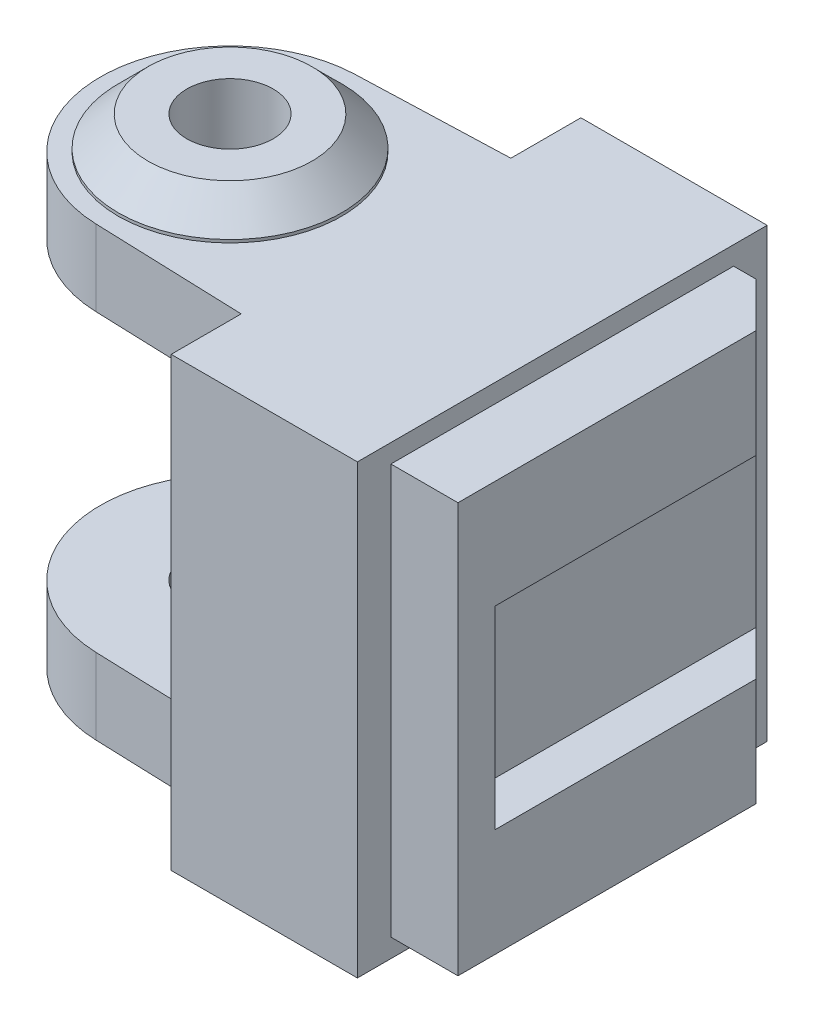
ISO-10303-21;
HEADER;
FILE_DESCRIPTION(('STEP AP214'),'2;1');
FILE_NAME('part.step','',(''),(''),'','','');
FILE_SCHEMA(('AUTOMOTIVE_DESIGN { 1 0 10303 214 1 1 1 1 }'));
ENDSEC;
DATA;
#1=APPLICATION_CONTEXT('core data for automotive mechanical design processes');
#2=APPLICATION_PROTOCOL_DEFINITION('international standard','automotive_design',2000,#1);
#3=PRODUCT_CONTEXT('',#1,'mechanical');
#4=PRODUCT('Part','Part','',(#3));
#5=PRODUCT_RELATED_PRODUCT_CATEGORY('part','',(#4));
#6=PRODUCT_DEFINITION_FORMATION('','',#4);
#7=PRODUCT_DEFINITION_CONTEXT('part definition',#1,'design');
#8=PRODUCT_DEFINITION('design','',#6,#7);
#9=PRODUCT_DEFINITION_SHAPE('','',#8);
#10=(LENGTH_UNIT() NAMED_UNIT(*) SI_UNIT(.MILLI.,.METRE.));
#11=(NAMED_UNIT(*) PLANE_ANGLE_UNIT() SI_UNIT($,.RADIAN.));
#12=(NAMED_UNIT(*) SI_UNIT($,.STERADIAN.) SOLID_ANGLE_UNIT());
#13=UNCERTAINTY_MEASURE_WITH_UNIT(LENGTH_MEASURE(1.E-05),#10,'distance_accuracy_value','');
#14=(GEOMETRIC_REPRESENTATION_CONTEXT(3) GLOBAL_UNCERTAINTY_ASSIGNED_CONTEXT((#13)) GLOBAL_UNIT_ASSIGNED_CONTEXT((#10,
#11,#12)) REPRESENTATION_CONTEXT('',''));
#15=CARTESIAN_POINT('',(0.,0.,0.));
#16=DIRECTION('',(0.,0.,1.));
#17=DIRECTION('',(1.,0.,0.));
#18=AXIS2_PLACEMENT_3D('',#15,#16,#17);
#19=CARTESIAN_POINT('',(26.8,0.,-8.5));
#20=DIRECTION('',(-0.707106781186547,0.,0.707106781186548));
#21=DIRECTION('',(0.,1.,0.));
#22=AXIS2_PLACEMENT_3D('',#19,#20,#21);
#23=PLANE('',#22);
#24=DIRECTION('',(0.707106781186548,0.,0.707106781186547));
#25=VECTOR('',#24,1.);
#26=CARTESIAN_POINT('',(26.8,8.5,-8.5));
#27=LINE('',#26,#25);
#28=CARTESIAN_POINT('',(26.8,8.5,-8.5));
#29=VERTEX_POINT('',#28);
#30=CARTESIAN_POINT('',(23.8,8.5,-11.5));
#31=VERTEX_POINT('',#30);
#32=EDGE_CURVE('E213',#29,#31,#27,.F.);
#33=ORIENTED_EDGE('',*,*,#32,.F.);
#34=DIRECTION('',(0.,1.,0.));
#35=VECTOR('',#34,1.);
#36=CARTESIAN_POINT('',(26.8,0.,-8.5));
#37=LINE('',#36,#35);
#38=CARTESIAN_POINT('',(26.8,1.25,-8.5));
#39=VERTEX_POINT('',#38);
#40=EDGE_CURVE('E359',#39,#29,#37,.T.);
#41=ORIENTED_EDGE('',*,*,#40,.F.);
#42=DIRECTION('',(-0.707106781186548,0.,-0.707106781186547));
#43=VECTOR('',#42,1.);
#44=CARTESIAN_POINT('',(34.55,1.25,-0.750000000000023));
#45=LINE('',#44,#43);
#46=CARTESIAN_POINT('',(23.8,1.25,-11.5));
#47=VERTEX_POINT('',#46);
#48=EDGE_CURVE('E214',#47,#39,#45,.F.);
#49=ORIENTED_EDGE('',*,*,#48,.F.);
#50=DIRECTION('',(0.,-1.,0.));
#51=VECTOR('',#50,1.);
#52=CARTESIAN_POINT('',(23.8,28.75,-11.5));
#53=LINE('',#52,#51);
#54=EDGE_CURVE('E68',#31,#47,#53,.T.);
#55=ORIENTED_EDGE('',*,*,#54,.F.);
#56=EDGE_LOOP('',(#33,#41,#49,#55));
#57=FACE_BOUND('',#56,.T.);
#58=ADVANCED_FACE('F44',(#57),#23,.F.);
#59=CARTESIAN_POINT('',(0.,30.,0.));
#60=DIRECTION('',(0.,1.,0.));
#61=DIRECTION('',(0.,0.,1.));
#62=AXIS2_PLACEMENT_3D('',#59,#60,#61);
#63=PLANE('',#62);
#64=CARTESIAN_POINT('',(0.,30.,0.));
#65=DIRECTION('',(0.,1.,0.));
#66=DIRECTION('',(0.,0.,1.));
#67=AXIS2_PLACEMENT_3D('',#64,#65,#66);
#68=CIRCLE('',#67,7.5);
#69=CARTESIAN_POINT('',(0.,30.,7.5));
#70=VERTEX_POINT('',#69);
#71=EDGE_CURVE('E227',#70,#70,#68,.T.);
#72=ORIENTED_EDGE('',*,*,#71,.F.);
#73=EDGE_LOOP('',(#72));
#74=FACE_BOUND('',#73,.T.);
#75=DIRECTION('',(-1.,0.,0.));
#76=VECTOR('',#75,1.);
#77=CARTESIAN_POINT('',(26.8,30.,13.75));
#78=LINE('',#77,#76);
#79=CARTESIAN_POINT('',(22.3,30.,13.75));
#80=VERTEX_POINT('',#79);
#81=CARTESIAN_POINT('',(9.8,30.,13.75));
#82=VERTEX_POINT('',#81);
#83=EDGE_CURVE('E434',#80,#82,#78,.T.);
#84=ORIENTED_EDGE('',*,*,#83,.F.);
#85=DIRECTION('',(0.,0.,1.));
#86=VECTOR('',#85,1.);
#87=CARTESIAN_POINT('',(22.3,30.,-13.75));
#88=LINE('',#87,#86);
#89=CARTESIAN_POINT('',(22.3,30.,-13.75));
#90=VERTEX_POINT('',#89);
#91=EDGE_CURVE('E385',#90,#80,#88,.T.);
#92=ORIENTED_EDGE('',*,*,#91,.F.);
#93=DIRECTION('',(-1.,0.,0.));
#94=VECTOR('',#93,1.);
#95=CARTESIAN_POINT('',(26.8,30.,-13.75));
#96=LINE('',#95,#94);
#97=CARTESIAN_POINT('',(9.8,30.,-13.75));
#98=VERTEX_POINT('',#97);
#99=EDGE_CURVE('E436',#90,#98,#96,.T.);
#100=ORIENTED_EDGE('',*,*,#99,.T.);
#101=DIRECTION('',(0.,0.,1.));
#102=VECTOR('',#101,1.);
#103=CARTESIAN_POINT('',(9.8,30.,13.75));
#104=LINE('',#103,#102);
#105=CARTESIAN_POINT('',(9.8,30.,-9.05));
#106=VERTEX_POINT('',#105);
#107=EDGE_CURVE('E431',#98,#106,#104,.T.);
#108=ORIENTED_EDGE('',*,*,#107,.T.);
#109=DIRECTION('',(-0.999382264938366,0.,0.0351438262951239));
#110=VECTOR('',#109,1.);
#111=CARTESIAN_POINT('',(-0.305751288767575,30.,-8.69462570496378));
#112=LINE('',#111,#110);
#113=CARTESIAN_POINT('',(-0.305751288767575,30.,-8.69462570496378));
#114=VERTEX_POINT('',#113);
#115=EDGE_CURVE('E341',#106,#114,#112,.T.);
#116=ORIENTED_EDGE('',*,*,#115,.T.);
#117=CARTESIAN_POINT('',(0.,30.,0.));
#118=DIRECTION('',(0.,1.,0.));
#119=DIRECTION('',(0.,0.,1.));
#120=AXIS2_PLACEMENT_3D('',#117,#118,#119);
#121=CIRCLE('',#120,8.7);
#122=CARTESIAN_POINT('',(-0.305751288767575,30.,8.69462570496378));
#123=VERTEX_POINT('',#122);
#124=EDGE_CURVE('E443',#114,#123,#121,.T.);
#125=ORIENTED_EDGE('',*,*,#124,.T.);
#126=DIRECTION('',(0.999382264938366,0.,0.0351438262951239));
#127=VECTOR('',#126,1.);
#128=CARTESIAN_POINT('',(9.8,30.,9.05));
#129=LINE('',#128,#127);
#130=CARTESIAN_POINT('',(9.8,30.,9.05));
#131=VERTEX_POINT('',#130);
#132=EDGE_CURVE('E345',#123,#131,#129,.T.);
#133=ORIENTED_EDGE('',*,*,#132,.T.);
#134=EDGE_CURVE('E430',#131,#82,#104,.T.);
#135=ORIENTED_EDGE('',*,*,#134,.T.);
#136=EDGE_LOOP('',(#84,#92,#100,#108,#116,#125,#133,#135));
#137=FACE_BOUND('',#136,.T.);
#138=ADVANCED_FACE('F249',(#74,#137),#63,.T.);
#139=CARTESIAN_POINT('',(0.,0.,0.));
#140=DIRECTION('',(0.,1.,0.));
#141=DIRECTION('',(0.,0.,1.));
#142=AXIS2_PLACEMENT_3D('',#139,#140,#141);
#143=PLANE('',#142);
#144=CARTESIAN_POINT('',(0.,0.,0.));
#145=DIRECTION('',(0.,1.,0.));
#146=DIRECTION('',(0.,0.,1.));
#147=AXIS2_PLACEMENT_3D('',#144,#145,#146);
#148=CIRCLE('',#147,7.5);
#149=CARTESIAN_POINT('',(0.,0.,7.5));
#150=VERTEX_POINT('',#149);
#151=EDGE_CURVE('E536',#150,#150,#148,.T.);
#152=ORIENTED_EDGE('',*,*,#151,.T.);
#153=EDGE_LOOP('',(#152));
#154=FACE_BOUND('',#153,.T.);
#155=DIRECTION('',(0.,0.,-1.));
#156=VECTOR('',#155,1.);
#157=CARTESIAN_POINT('',(22.3,0.,13.75));
#158=LINE('',#157,#156);
#159=CARTESIAN_POINT('',(22.3,0.,13.75));
#160=VERTEX_POINT('',#159);
#161=CARTESIAN_POINT('',(22.3,0.,-13.75));
#162=VERTEX_POINT('',#161);
#163=EDGE_CURVE('E395',#160,#162,#158,.T.);
#164=ORIENTED_EDGE('',*,*,#163,.F.);
#165=DIRECTION('',(-1.,0.,0.));
#166=VECTOR('',#165,1.);
#167=CARTESIAN_POINT('',(26.8,0.,13.75));
#168=LINE('',#167,#166);
#169=CARTESIAN_POINT('',(9.8,0.,13.75));
#170=VERTEX_POINT('',#169);
#171=EDGE_CURVE('E440',#160,#170,#168,.T.);
#172=ORIENTED_EDGE('',*,*,#171,.T.);
#173=DIRECTION('',(0.,0.,-1.));
#174=VECTOR('',#173,1.);
#175=CARTESIAN_POINT('',(9.8,0.,13.75));
#176=LINE('',#175,#174);
#177=CARTESIAN_POINT('',(9.8,0.,9.05));
#178=VERTEX_POINT('',#177);
#179=EDGE_CURVE('E424',#170,#178,#176,.T.);
#180=ORIENTED_EDGE('',*,*,#179,.T.);
#181=DIRECTION('',(0.999382264938366,0.,0.0351438262951239));
#182=VECTOR('',#181,1.);
#183=CARTESIAN_POINT('',(9.8,0.,9.05));
#184=LINE('',#183,#182);
#185=CARTESIAN_POINT('',(-0.305751288767575,0.,8.69462570496378));
#186=VERTEX_POINT('',#185);
#187=EDGE_CURVE('E447',#186,#178,#184,.T.);
#188=ORIENTED_EDGE('',*,*,#187,.F.);
#189=CARTESIAN_POINT('',(0.,0.,0.));
#190=DIRECTION('',(0.,1.,0.));
#191=DIRECTION('',(0.,0.,1.));
#192=AXIS2_PLACEMENT_3D('',#189,#190,#191);
#193=CIRCLE('',#192,8.7);
#194=CARTESIAN_POINT('',(-0.305751288767575,0.,-8.69462570496378));
#195=VERTEX_POINT('',#194);
#196=EDGE_CURVE('E442',#195,#186,#193,.T.);
#197=ORIENTED_EDGE('',*,*,#196,.F.);
#198=DIRECTION('',(-0.999382264938366,0.,0.0351438262951239));
#199=VECTOR('',#198,1.);
#200=CARTESIAN_POINT('',(-0.305751288767575,0.,-8.69462570496378));
#201=LINE('',#200,#199);
#202=CARTESIAN_POINT('',(9.8,0.,-9.05));
#203=VERTEX_POINT('',#202);
#204=EDGE_CURVE('E338',#203,#195,#201,.T.);
#205=ORIENTED_EDGE('',*,*,#204,.F.);
#206=CARTESIAN_POINT('',(9.8,0.,-13.75));
#207=VERTEX_POINT('',#206);
#208=EDGE_CURVE('E423',#203,#207,#176,.T.);
#209=ORIENTED_EDGE('',*,*,#208,.T.);
#210=DIRECTION('',(-1.,0.,0.));
#211=VECTOR('',#210,1.);
#212=CARTESIAN_POINT('',(26.8,0.,-13.75));
#213=LINE('',#212,#211);
#214=EDGE_CURVE('E438',#162,#207,#213,.T.);
#215=ORIENTED_EDGE('',*,*,#214,.F.);
#216=EDGE_LOOP('',(#164,#172,#180,#188,#197,#205,#209,#215));
#217=FACE_BOUND('',#216,.T.);
#218=ADVANCED_FACE('F255',(#154,#217),#143,.F.);
#219=CARTESIAN_POINT('',(26.8,30.,13.75));
#220=DIRECTION('',(0.,0.,-1.));
#221=DIRECTION('',(0.,1.,0.));
#222=AXIS2_PLACEMENT_3D('',#219,#220,#221);
#223=PLANE('',#222);
#224=DIRECTION('',(0.,-1.,0.));
#225=VECTOR('',#224,1.);
#226=CARTESIAN_POINT('',(22.3,30.,13.75));
#227=LINE('',#226,#225);
#228=EDGE_CURVE('E393',#80,#160,#227,.T.);
#229=ORIENTED_EDGE('',*,*,#228,.F.);
#230=ORIENTED_EDGE('',*,*,#83,.T.);
#231=DIRECTION('',(0.,-1.,0.));
#232=VECTOR('',#231,1.);
#233=CARTESIAN_POINT('',(9.8,30.,13.75));
#234=LINE('',#233,#232);
#235=EDGE_CURVE('E409',#82,#170,#234,.T.);
#236=ORIENTED_EDGE('',*,*,#235,.T.);
#237=ORIENTED_EDGE('',*,*,#171,.F.);
#238=EDGE_LOOP('',(#229,#230,#236,#237));
#239=FACE_BOUND('',#238,.T.);
#240=ADVANCED_FACE('F293',(#239),#223,.F.);
#241=CARTESIAN_POINT('',(26.8,30.,-13.75));
#242=DIRECTION('',(0.,0.,1.));
#243=DIRECTION('',(0.,-1.,0.));
#244=AXIS2_PLACEMENT_3D('',#241,#242,#243);
#245=PLANE('',#244);
#246=DIRECTION('',(0.,1.,0.));
#247=VECTOR('',#246,1.);
#248=CARTESIAN_POINT('',(22.3,0.,-13.75));
#249=LINE('',#248,#247);
#250=EDGE_CURVE('E397',#162,#90,#249,.T.);
#251=ORIENTED_EDGE('',*,*,#250,.F.);
#252=ORIENTED_EDGE('',*,*,#214,.T.);
#253=DIRECTION('',(0.,1.,0.));
#254=VECTOR('',#253,1.);
#255=CARTESIAN_POINT('',(9.8,30.,-13.75));
#256=LINE('',#255,#254);
#257=EDGE_CURVE('E427',#207,#98,#256,.T.);
#258=ORIENTED_EDGE('',*,*,#257,.T.);
#259=ORIENTED_EDGE('',*,*,#99,.F.);
#260=EDGE_LOOP('',(#251,#252,#258,#259));
#261=FACE_BOUND('',#260,.T.);
#262=ADVANCED_FACE('F289',(#261),#245,.F.);
#263=CARTESIAN_POINT('',(0.,30.,0.));
#264=DIRECTION('',(0.,-1.,0.));
#265=DIRECTION('',(0.,0.,-1.));
#266=AXIS2_PLACEMENT_3D('',#263,#264,#265);
#267=CYLINDRICAL_SURFACE('',#266,8.7);
#268=CARTESIAN_POINT('',(0.,5.1,0.));
#269=DIRECTION('',(0.,1.,0.));
#270=DIRECTION('',(0.,0.,1.));
#271=AXIS2_PLACEMENT_3D('',#268,#269,#270);
#272=CIRCLE('',#271,8.7);
#273=CARTESIAN_POINT('',(-0.305751288767575,5.1,8.69462570496378));
#274=VERTEX_POINT('',#273);
#275=CARTESIAN_POINT('',(-0.305751288767575,5.1,-8.69462570496378));
#276=VERTEX_POINT('',#275);
#277=EDGE_CURVE('E323',#274,#276,#272,.F.);
#278=ORIENTED_EDGE('',*,*,#277,.T.);
#279=DIRECTION('',(0.,-1.,0.));
#280=VECTOR('',#279,1.);
#281=CARTESIAN_POINT('',(-0.305751288767575,30.,-8.69462570496378));
#282=LINE('',#281,#280);
#283=EDGE_CURVE('E326',#276,#195,#282,.T.);
#284=ORIENTED_EDGE('',*,*,#283,.T.);
#285=ORIENTED_EDGE('',*,*,#196,.T.);
#286=DIRECTION('',(0.,-1.,0.));
#287=VECTOR('',#286,1.);
#288=CARTESIAN_POINT('',(-0.305751288767575,30.,8.69462570496378));
#289=LINE('',#288,#287);
#290=EDGE_CURVE('E328',#274,#186,#289,.T.);
#291=ORIENTED_EDGE('',*,*,#290,.F.);
#292=EDGE_LOOP('',(#278,#284,#285,#291));
#293=FACE_BOUND('',#292,.T.);
#294=ADVANCED_FACE('F292',(#293),#267,.T.);
#295=CARTESIAN_POINT('',(0.,24.9,0.));
#296=DIRECTION('',(0.,-1.,0.));
#297=DIRECTION('',(0.,0.,-1.));
#298=AXIS2_PLACEMENT_3D('',#295,#296,#297);
#299=CIRCLE('',#298,8.7);
#300=CARTESIAN_POINT('',(-0.305751288767575,24.9,-8.69462570496378));
#301=VERTEX_POINT('',#300);
#302=CARTESIAN_POINT('',(-0.305751288767575,24.9,8.69462570496378));
#303=VERTEX_POINT('',#302);
#304=EDGE_CURVE('E410',#301,#303,#299,.F.);
#305=ORIENTED_EDGE('',*,*,#304,.T.);
#306=EDGE_CURVE('E357',#123,#303,#289,.T.);
#307=ORIENTED_EDGE('',*,*,#306,.F.);
#308=ORIENTED_EDGE('',*,*,#124,.F.);
#309=EDGE_CURVE('E340',#114,#301,#282,.T.);
#310=ORIENTED_EDGE('',*,*,#309,.T.);
#311=EDGE_LOOP('',(#305,#307,#308,#310));
#312=FACE_BOUND('',#311,.T.);
#313=ADVANCED_FACE('F313',(#312),#267,.T.);
#314=CARTESIAN_POINT('',(9.8,30.,9.05));
#315=DIRECTION('',(0.0351438262951239,0.,-0.999382264938366));
#316=DIRECTION('',(-0.999382264938366,0.,-0.0351438262951239));
#317=AXIS2_PLACEMENT_3D('',#314,#315,#316);
#318=PLANE('',#317);
#319=DIRECTION('',(-0.999382264938366,0.,-0.0351438262951239));
#320=VECTOR('',#319,1.);
#321=CARTESIAN_POINT('',(-9.47893388841664,5.1,8.37204570012909));
#322=LINE('',#321,#320);
#323=CARTESIAN_POINT('',(9.8,5.1,9.05));
#324=VERTEX_POINT('',#323);
#325=EDGE_CURVE('E332',#324,#274,#322,.T.);
#326=ORIENTED_EDGE('',*,*,#325,.T.);
#327=ORIENTED_EDGE('',*,*,#290,.T.);
#328=ORIENTED_EDGE('',*,*,#187,.T.);
#329=DIRECTION('',(0.,-1.,0.));
#330=VECTOR('',#329,1.);
#331=CARTESIAN_POINT('',(9.8,30.,9.05));
#332=LINE('',#331,#330);
#333=EDGE_CURVE('E353',#324,#178,#332,.T.);
#334=ORIENTED_EDGE('',*,*,#333,.F.);
#335=EDGE_LOOP('',(#326,#327,#328,#334));
#336=FACE_BOUND('',#335,.T.);
#337=ADVANCED_FACE('F311',(#336),#318,.F.);
#338=DIRECTION('',(0.999382264938366,0.,0.0351438262951239));
#339=VECTOR('',#338,1.);
#340=CARTESIAN_POINT('',(-9.47893388841664,24.9,8.37204570012909));
#341=LINE('',#340,#339);
#342=CARTESIAN_POINT('',(9.8,24.9,9.05));
#343=VERTEX_POINT('',#342);
#344=EDGE_CURVE('E403',#303,#343,#341,.T.);
#345=ORIENTED_EDGE('',*,*,#344,.T.);
#346=EDGE_CURVE('E354',#131,#343,#332,.T.);
#347=ORIENTED_EDGE('',*,*,#346,.F.);
#348=ORIENTED_EDGE('',*,*,#132,.F.);
#349=ORIENTED_EDGE('',*,*,#306,.T.);
#350=EDGE_LOOP('',(#345,#347,#348,#349));
#351=FACE_BOUND('',#350,.T.);
#352=ADVANCED_FACE('F309',(#351),#318,.F.);
#353=CARTESIAN_POINT('',(-0.305751288767575,30.,-8.69462570496378));
#354=DIRECTION('',(0.0351438262951239,0.,0.999382264938366));
#355=DIRECTION('',(0.999382264938366,0.,-0.0351438262951239));
#356=AXIS2_PLACEMENT_3D('',#353,#354,#355);
#357=PLANE('',#356);
#358=DIRECTION('',(0.999382264938366,0.,-0.0351438262951239));
#359=VECTOR('',#358,1.);
#360=CARTESIAN_POINT('',(-8.51307567857754,5.1,-8.40601063461229));
#361=LINE('',#360,#359);
#362=CARTESIAN_POINT('',(9.8,5.1,-9.05));
#363=VERTEX_POINT('',#362);
#364=EDGE_CURVE('E335',#276,#363,#361,.T.);
#365=ORIENTED_EDGE('',*,*,#364,.T.);
#366=DIRECTION('',(0.,-1.,0.));
#367=VECTOR('',#366,1.);
#368=CARTESIAN_POINT('',(9.8,30.,-9.05));
#369=LINE('',#368,#367);
#370=EDGE_CURVE('E344',#363,#203,#369,.T.);
#371=ORIENTED_EDGE('',*,*,#370,.T.);
#372=ORIENTED_EDGE('',*,*,#204,.T.);
#373=ORIENTED_EDGE('',*,*,#283,.F.);
#374=EDGE_LOOP('',(#365,#371,#372,#373));
#375=FACE_BOUND('',#374,.T.);
#376=ADVANCED_FACE('F306',(#375),#357,.F.);
#377=DIRECTION('',(-0.999382264938366,0.,0.0351438262951239));
#378=VECTOR('',#377,1.);
#379=CARTESIAN_POINT('',(-8.51307567857754,24.9,-8.40601063461229));
#380=LINE('',#379,#378);
#381=CARTESIAN_POINT('',(9.8,24.9,-9.05));
#382=VERTEX_POINT('',#381);
#383=EDGE_CURVE('E399',#382,#301,#380,.T.);
#384=ORIENTED_EDGE('',*,*,#383,.T.);
#385=ORIENTED_EDGE('',*,*,#309,.F.);
#386=ORIENTED_EDGE('',*,*,#115,.F.);
#387=EDGE_CURVE('E350',#106,#382,#369,.T.);
#388=ORIENTED_EDGE('',*,*,#387,.T.);
#389=EDGE_LOOP('',(#384,#385,#386,#388));
#390=FACE_BOUND('',#389,.T.);
#391=ADVANCED_FACE('F300',(#390),#357,.F.);
#392=CARTESIAN_POINT('',(0.,30.,0.));
#393=DIRECTION('',(0.,-1.,0.));
#394=DIRECTION('',(0.,0.,-1.));
#395=AXIS2_PLACEMENT_3D('',#392,#393,#394);
#396=CYLINDRICAL_SURFACE('',#395,2.9);
#397=CARTESIAN_POINT('',(0.,5.1,0.));
#398=DIRECTION('',(0.,1.,0.));
#399=DIRECTION('',(0.,0.,1.));
#400=AXIS2_PLACEMENT_3D('',#397,#398,#399);
#401=CIRCLE('',#400,2.9);
#402=CARTESIAN_POINT('',(0.,5.1,2.9));
#403=VERTEX_POINT('',#402);
#404=EDGE_CURVE('E407',#403,#403,#401,.F.);
#405=ORIENTED_EDGE('',*,*,#404,.F.);
#406=EDGE_LOOP('',(#405));
#407=FACE_BOUND('',#406,.T.);
#408=CARTESIAN_POINT('',(0.,-2.2,0.));
#409=DIRECTION('',(0.,1.,0.));
#410=DIRECTION('',(0.,0.,1.));
#411=AXIS2_PLACEMENT_3D('',#408,#409,#410);
#412=CIRCLE('',#411,2.9);
#413=CARTESIAN_POINT('',(0.,-2.2,2.9));
#414=VERTEX_POINT('',#413);
#415=EDGE_CURVE('E541',#414,#414,#412,.T.);
#416=ORIENTED_EDGE('',*,*,#415,.F.);
#417=EDGE_LOOP('',(#416));
#418=FACE_BOUND('',#417,.T.);
#419=ADVANCED_FACE('F298',(#407,#418),#396,.F.);
#420=CARTESIAN_POINT('',(0.,24.9,0.));
#421=DIRECTION('',(0.,-1.,0.));
#422=DIRECTION('',(0.,0.,-1.));
#423=AXIS2_PLACEMENT_3D('',#420,#421,#422);
#424=CIRCLE('',#423,2.9);
#425=CARTESIAN_POINT('',(0.,24.9,-2.9));
#426=VERTEX_POINT('',#425);
#427=EDGE_CURVE('E416',#426,#426,#424,.F.);
#428=ORIENTED_EDGE('',*,*,#427,.F.);
#429=EDGE_LOOP('',(#428));
#430=FACE_BOUND('',#429,.T.);
#431=CARTESIAN_POINT('',(0.,32.2,0.));
#432=DIRECTION('',(0.,1.,0.));
#433=DIRECTION('',(0.,0.,1.));
#434=AXIS2_PLACEMENT_3D('',#431,#432,#433);
#435=CIRCLE('',#434,2.9);
#436=CARTESIAN_POINT('',(0.,32.2,2.9));
#437=VERTEX_POINT('',#436);
#438=EDGE_CURVE('E534',#437,#437,#435,.T.);
#439=ORIENTED_EDGE('',*,*,#438,.T.);
#440=EDGE_LOOP('',(#439));
#441=FACE_BOUND('',#440,.T.);
#442=ADVANCED_FACE('F287',(#430,#441),#396,.F.);
#443=CARTESIAN_POINT('',(9.8,0.,0.));
#444=DIRECTION('',(1.,0.,0.));
#445=DIRECTION('',(0.,0.,-1.));
#446=AXIS2_PLACEMENT_3D('',#443,#444,#445);
#447=PLANE('',#446);
#448=ORIENTED_EDGE('',*,*,#134,.F.);
#449=ORIENTED_EDGE('',*,*,#346,.T.);
#450=DIRECTION('',(0.,0.,-1.));
#451=VECTOR('',#450,1.);
#452=CARTESIAN_POINT('',(9.8,24.9,-13.75));
#453=LINE('',#452,#451);
#454=EDGE_CURVE('E414',#343,#382,#453,.T.);
#455=ORIENTED_EDGE('',*,*,#454,.T.);
#456=ORIENTED_EDGE('',*,*,#387,.F.);
#457=ORIENTED_EDGE('',*,*,#107,.F.);
#458=ORIENTED_EDGE('',*,*,#257,.F.);
#459=ORIENTED_EDGE('',*,*,#208,.F.);
#460=ORIENTED_EDGE('',*,*,#370,.F.);
#461=DIRECTION('',(0.,0.,1.));
#462=VECTOR('',#461,1.);
#463=CARTESIAN_POINT('',(9.8,5.1,-13.75));
#464=LINE('',#463,#462);
#465=EDGE_CURVE('E331',#363,#324,#464,.T.);
#466=ORIENTED_EDGE('',*,*,#465,.T.);
#467=ORIENTED_EDGE('',*,*,#333,.T.);
#468=ORIENTED_EDGE('',*,*,#179,.F.);
#469=ORIENTED_EDGE('',*,*,#235,.F.);
#470=EDGE_LOOP('',(#448,#449,#455,#456,#457,#458,#459,#460,#466,#467,#468,#469));
#471=FACE_BOUND('',#470,.T.);
#472=ADVANCED_FACE('F284',(#471),#447,.F.);
#473=CARTESIAN_POINT('',(-8.701,5.1,-13.75));
#474=DIRECTION('',(0.,1.,0.));
#475=DIRECTION('',(0.,0.,1.));
#476=AXIS2_PLACEMENT_3D('',#473,#474,#475);
#477=PLANE('',#476);
#478=ORIENTED_EDGE('',*,*,#404,.T.);
#479=EDGE_LOOP('',(#478));
#480=FACE_BOUND('',#479,.T.);
#481=ORIENTED_EDGE('',*,*,#465,.F.);
#482=ORIENTED_EDGE('',*,*,#364,.F.);
#483=ORIENTED_EDGE('',*,*,#277,.F.);
#484=ORIENTED_EDGE('',*,*,#325,.F.);
#485=EDGE_LOOP('',(#481,#482,#483,#484));
#486=FACE_BOUND('',#485,.T.);
#487=ADVANCED_FACE('F282',(#480,#486),#477,.T.);
#488=CARTESIAN_POINT('',(-8.701,24.9,-13.75));
#489=DIRECTION('',(0.,-1.,0.));
#490=DIRECTION('',(0.,0.,-1.));
#491=AXIS2_PLACEMENT_3D('',#488,#489,#490);
#492=PLANE('',#491);
#493=ORIENTED_EDGE('',*,*,#427,.T.);
#494=EDGE_LOOP('',(#493));
#495=FACE_BOUND('',#494,.T.);
#496=ORIENTED_EDGE('',*,*,#304,.F.);
#497=ORIENTED_EDGE('',*,*,#383,.F.);
#498=ORIENTED_EDGE('',*,*,#454,.F.);
#499=ORIENTED_EDGE('',*,*,#344,.F.);
#500=EDGE_LOOP('',(#496,#497,#498,#499));
#501=FACE_BOUND('',#500,.T.);
#502=ADVANCED_FACE('F468',(#495,#501),#492,.T.);
#503=CARTESIAN_POINT('',(22.3,0.,0.));
#504=DIRECTION('',(1.,0.,0.));
#505=DIRECTION('',(0.,0.,-1.));
#506=AXIS2_PLACEMENT_3D('',#503,#504,#505);
#507=PLANE('',#506);
#508=DIRECTION('',(0.,0.,1.));
#509=VECTOR('',#508,1.);
#510=CARTESIAN_POINT('',(22.3,28.75,11.5));
#511=LINE('',#510,#509);
#512=CARTESIAN_POINT('',(22.3,28.75,-11.5));
#513=VERTEX_POINT('',#512);
#514=CARTESIAN_POINT('',(22.3,28.75,11.5));
#515=VERTEX_POINT('',#514);
#516=EDGE_CURVE('E391',#513,#515,#511,.T.);
#517=ORIENTED_EDGE('',*,*,#516,.F.);
#518=DIRECTION('',(0.,1.,0.));
#519=VECTOR('',#518,1.);
#520=CARTESIAN_POINT('',(22.3,28.75,-11.5));
#521=LINE('',#520,#519);
#522=CARTESIAN_POINT('',(22.3,1.25,-11.5));
#523=VERTEX_POINT('',#522);
#524=EDGE_CURVE('E557',#523,#513,#521,.T.);
#525=ORIENTED_EDGE('',*,*,#524,.F.);
#526=DIRECTION('',(0.,0.,-1.));
#527=VECTOR('',#526,1.);
#528=CARTESIAN_POINT('',(22.3,1.25,11.5));
#529=LINE('',#528,#527);
#530=CARTESIAN_POINT('',(22.3,1.25,11.5));
#531=VERTEX_POINT('',#530);
#532=EDGE_CURVE('E378',#531,#523,#529,.T.);
#533=ORIENTED_EDGE('',*,*,#532,.F.);
#534=DIRECTION('',(0.,-1.,0.));
#535=VECTOR('',#534,1.);
#536=CARTESIAN_POINT('',(22.3,28.75,11.5));
#537=LINE('',#536,#535);
#538=EDGE_CURVE('E374',#515,#531,#537,.T.);
#539=ORIENTED_EDGE('',*,*,#538,.F.);
#540=EDGE_LOOP('',(#517,#525,#533,#539));
#541=FACE_BOUND('',#540,.T.);
#542=ORIENTED_EDGE('',*,*,#91,.T.);
#543=ORIENTED_EDGE('',*,*,#228,.T.);
#544=ORIENTED_EDGE('',*,*,#163,.T.);
#545=ORIENTED_EDGE('',*,*,#250,.T.);
#546=EDGE_LOOP('',(#542,#543,#544,#545));
#547=FACE_BOUND('',#546,.T.);
#548=ADVANCED_FACE('F480',(#541,#547),#507,.T.);
#549=CARTESIAN_POINT('',(22.3,28.75,11.5));
#550=DIRECTION('',(0.,0.,1.));
#551=DIRECTION('',(1.,0.,0.));
#552=AXIS2_PLACEMENT_3D('',#549,#550,#551);
#553=PLANE('',#552);
#554=DIRECTION('',(0.,-1.,0.));
#555=VECTOR('',#554,1.);
#556=CARTESIAN_POINT('',(26.8,28.75,11.5));
#557=LINE('',#556,#555);
#558=CARTESIAN_POINT('',(26.8,28.75,11.5));
#559=VERTEX_POINT('',#558);
#560=CARTESIAN_POINT('',(26.8,1.25,11.5));
#561=VERTEX_POINT('',#560);
#562=EDGE_CURVE('E380',#559,#561,#557,.T.);
#563=ORIENTED_EDGE('',*,*,#562,.F.);
#564=DIRECTION('',(1.,0.,0.));
#565=VECTOR('',#564,1.);
#566=CARTESIAN_POINT('',(22.3,28.75,11.5));
#567=LINE('',#566,#565);
#568=EDGE_CURVE('E372',#515,#559,#567,.T.);
#569=ORIENTED_EDGE('',*,*,#568,.F.);
#570=ORIENTED_EDGE('',*,*,#538,.T.);
#571=DIRECTION('',(1.,0.,0.));
#572=VECTOR('',#571,1.);
#573=CARTESIAN_POINT('',(22.3,1.25,11.5));
#574=LINE('',#573,#572);
#575=EDGE_CURVE('E389',#531,#561,#574,.T.);
#576=ORIENTED_EDGE('',*,*,#575,.T.);
#577=EDGE_LOOP('',(#563,#569,#570,#576));
#578=FACE_BOUND('',#577,.T.);
#579=ADVANCED_FACE('F482',(#578),#553,.T.);
#580=CARTESIAN_POINT('',(22.3,28.75,11.5));
#581=DIRECTION('',(0.,1.,0.));
#582=DIRECTION('',(0.,0.,1.));
#583=AXIS2_PLACEMENT_3D('',#580,#581,#582);
#584=PLANE('',#583);
#585=DIRECTION('',(0.,0.,1.));
#586=VECTOR('',#585,1.);
#587=CARTESIAN_POINT('',(26.8,28.75,11.5));
#588=LINE('',#587,#586);
#589=CARTESIAN_POINT('',(26.8,28.75,-8.5));
#590=VERTEX_POINT('',#589);
#591=EDGE_CURVE('E365',#590,#559,#588,.T.);
#592=ORIENTED_EDGE('',*,*,#591,.F.);
#593=DIRECTION('',(0.707106781186548,0.,0.707106781186547));
#594=VECTOR('',#593,1.);
#595=CARTESIAN_POINT('',(34.55,28.75,-0.750000000000023));
#596=LINE('',#595,#594);
#597=CARTESIAN_POINT('',(23.8,28.75,-11.5));
#598=VERTEX_POINT('',#597);
#599=EDGE_CURVE('E222',#590,#598,#596,.F.);
#600=ORIENTED_EDGE('',*,*,#599,.T.);
#601=DIRECTION('',(1.,0.,0.));
#602=VECTOR('',#601,1.);
#603=CARTESIAN_POINT('',(22.3,28.75,-11.5));
#604=LINE('',#603,#602);
#605=EDGE_CURVE('E219',#513,#598,#604,.T.);
#606=ORIENTED_EDGE('',*,*,#605,.F.);
#607=ORIENTED_EDGE('',*,*,#516,.T.);
#608=ORIENTED_EDGE('',*,*,#568,.T.);
#609=EDGE_LOOP('',(#592,#600,#606,#607,#608));
#610=FACE_BOUND('',#609,.T.);
#611=ADVANCED_FACE('F370',(#610),#584,.T.);
#612=CARTESIAN_POINT('',(22.3,28.75,-11.5));
#613=DIRECTION('',(0.,0.,-1.));
#614=DIRECTION('',(-1.,0.,0.));
#615=AXIS2_PLACEMENT_3D('',#612,#613,#614);
#616=PLANE('',#615);
#617=ORIENTED_EDGE('',*,*,#605,.T.);
#618=CARTESIAN_POINT('',(23.8,21.5,-11.5));
#619=VERTEX_POINT('',#618);
#620=EDGE_CURVE('E211',#598,#619,#53,.T.);
#621=ORIENTED_EDGE('',*,*,#620,.T.);
#622=DIRECTION('',(0.,1.,0.));
#623=VECTOR('',#622,1.);
#624=CARTESIAN_POINT('',(23.8,21.5,-11.5));
#625=LINE('',#624,#623);
#626=EDGE_CURVE('E200',#31,#619,#625,.T.);
#627=ORIENTED_EDGE('',*,*,#626,.F.);
#628=ORIENTED_EDGE('',*,*,#54,.T.);
#629=DIRECTION('',(1.,0.,0.));
#630=VECTOR('',#629,1.);
#631=CARTESIAN_POINT('',(22.3,1.25,-11.5));
#632=LINE('',#631,#630);
#633=EDGE_CURVE('E387',#523,#47,#632,.T.);
#634=ORIENTED_EDGE('',*,*,#633,.F.);
#635=ORIENTED_EDGE('',*,*,#524,.T.);
#636=EDGE_LOOP('',(#617,#621,#627,#628,#634,#635));
#637=FACE_BOUND('',#636,.T.);
#638=ADVANCED_FACE('F217',(#637),#616,.T.);
#639=CARTESIAN_POINT('',(22.3,1.25,11.5));
#640=DIRECTION('',(0.,-1.,0.));
#641=DIRECTION('',(0.,0.,-1.));
#642=AXIS2_PLACEMENT_3D('',#639,#640,#641);
#643=PLANE('',#642);
#644=ORIENTED_EDGE('',*,*,#633,.T.);
#645=ORIENTED_EDGE('',*,*,#48,.T.);
#646=DIRECTION('',(0.,0.,-1.));
#647=VECTOR('',#646,1.);
#648=CARTESIAN_POINT('',(26.8,1.25,11.5));
#649=LINE('',#648,#647);
#650=EDGE_CURVE('E375',#561,#39,#649,.T.);
#651=ORIENTED_EDGE('',*,*,#650,.F.);
#652=ORIENTED_EDGE('',*,*,#575,.F.);
#653=ORIENTED_EDGE('',*,*,#532,.T.);
#654=EDGE_LOOP('',(#644,#645,#651,#652,#653));
#655=FACE_BOUND('',#654,.T.);
#656=ADVANCED_FACE('F271',(#655),#643,.T.);
#657=CARTESIAN_POINT('',(26.8,0.,0.));
#658=DIRECTION('',(1.,0.,0.));
#659=DIRECTION('',(0.,0.,-1.));
#660=AXIS2_PLACEMENT_3D('',#657,#658,#659);
#661=PLANE('',#660);
#662=DIRECTION('',(0.,0.,-1.));
#663=VECTOR('',#662,1.);
#664=CARTESIAN_POINT('',(26.8,8.5,-11.5));
#665=LINE('',#664,#663);
#666=CARTESIAN_POINT('',(26.8,8.5,9.));
#667=VERTEX_POINT('',#666);
#668=EDGE_CURVE('E204',#667,#29,#665,.T.);
#669=ORIENTED_EDGE('',*,*,#668,.F.);
#670=DIRECTION('',(0.,-1.,0.));
#671=VECTOR('',#670,1.);
#672=CARTESIAN_POINT('',(26.8,21.5,9.));
#673=LINE('',#672,#671);
#674=CARTESIAN_POINT('',(26.8,21.5,9.));
#675=VERTEX_POINT('',#674);
#676=EDGE_CURVE('E538',#675,#667,#673,.T.);
#677=ORIENTED_EDGE('',*,*,#676,.F.);
#678=DIRECTION('',(0.,0.,1.));
#679=VECTOR('',#678,1.);
#680=CARTESIAN_POINT('',(26.8,21.5,-11.5));
#681=LINE('',#680,#679);
#682=CARTESIAN_POINT('',(26.8,21.5,-8.5));
#683=VERTEX_POINT('',#682);
#684=EDGE_CURVE('E368',#683,#675,#681,.T.);
#685=ORIENTED_EDGE('',*,*,#684,.F.);
#686=EDGE_CURVE('E212',#683,#590,#37,.T.);
#687=ORIENTED_EDGE('',*,*,#686,.T.);
#688=ORIENTED_EDGE('',*,*,#591,.T.);
#689=ORIENTED_EDGE('',*,*,#562,.T.);
#690=ORIENTED_EDGE('',*,*,#650,.T.);
#691=ORIENTED_EDGE('',*,*,#40,.T.);
#692=EDGE_LOOP('',(#669,#677,#685,#687,#688,#689,#690,#691));
#693=FACE_BOUND('',#692,.T.);
#694=ADVANCED_FACE('F263',(#693),#661,.T.);
#695=DIRECTION('',(-0.707106781186548,0.,-0.707106781186547));
#696=VECTOR('',#695,1.);
#697=CARTESIAN_POINT('',(26.8,21.5,-8.5));
#698=LINE('',#697,#696);
#699=EDGE_CURVE('E194',#619,#683,#698,.F.);
#700=ORIENTED_EDGE('',*,*,#699,.F.);
#701=ORIENTED_EDGE('',*,*,#620,.F.);
#702=ORIENTED_EDGE('',*,*,#599,.F.);
#703=ORIENTED_EDGE('',*,*,#686,.F.);
#704=EDGE_LOOP('',(#700,#701,#702,#703));
#705=FACE_BOUND('',#704,.T.);
#706=ADVANCED_FACE('F209',(#705),#23,.F.);
#707=CARTESIAN_POINT('',(23.8,8.5,-11.5));
#708=DIRECTION('',(0.,-1.,0.));
#709=DIRECTION('',(0.,0.,-1.));
#710=AXIS2_PLACEMENT_3D('',#707,#708,#709);
#711=PLANE('',#710);
#712=ORIENTED_EDGE('',*,*,#32,.T.);
#713=DIRECTION('',(0.,0.,-1.));
#714=VECTOR('',#713,1.);
#715=CARTESIAN_POINT('',(23.8,8.5,-11.5));
#716=LINE('',#715,#714);
#717=CARTESIAN_POINT('',(23.8,8.5,9.));
#718=VERTEX_POINT('',#717);
#719=EDGE_CURVE('E60',#718,#31,#716,.T.);
#720=ORIENTED_EDGE('',*,*,#719,.F.);
#721=DIRECTION('',(1.,0.,0.));
#722=VECTOR('',#721,1.);
#723=CARTESIAN_POINT('',(23.8,8.5,9.));
#724=LINE('',#723,#722);
#725=EDGE_CURVE('E552',#718,#667,#724,.T.);
#726=ORIENTED_EDGE('',*,*,#725,.T.);
#727=ORIENTED_EDGE('',*,*,#668,.T.);
#728=EDGE_LOOP('',(#712,#720,#726,#727));
#729=FACE_BOUND('',#728,.T.);
#730=ADVANCED_FACE('F262',(#729),#711,.F.);
#731=CARTESIAN_POINT('',(23.8,21.5,9.));
#732=DIRECTION('',(0.,0.,1.));
#733=DIRECTION('',(1.,0.,0.));
#734=AXIS2_PLACEMENT_3D('',#731,#732,#733);
#735=PLANE('',#734);
#736=ORIENTED_EDGE('',*,*,#676,.T.);
#737=ORIENTED_EDGE('',*,*,#725,.F.);
#738=DIRECTION('',(0.,-1.,0.));
#739=VECTOR('',#738,1.);
#740=CARTESIAN_POINT('',(23.8,21.5,9.));
#741=LINE('',#740,#739);
#742=CARTESIAN_POINT('',(23.8,21.5,9.));
#743=VERTEX_POINT('',#742);
#744=EDGE_CURVE('E199',#743,#718,#741,.T.);
#745=ORIENTED_EDGE('',*,*,#744,.F.);
#746=DIRECTION('',(1.,0.,0.));
#747=VECTOR('',#746,1.);
#748=CARTESIAN_POINT('',(23.8,21.5,9.));
#749=LINE('',#748,#747);
#750=EDGE_CURVE('E197',#743,#675,#749,.T.);
#751=ORIENTED_EDGE('',*,*,#750,.T.);
#752=EDGE_LOOP('',(#736,#737,#745,#751));
#753=FACE_BOUND('',#752,.T.);
#754=ADVANCED_FACE('F268',(#753),#735,.F.);
#755=CARTESIAN_POINT('',(23.8,21.5,-11.5));
#756=DIRECTION('',(0.,1.,0.));
#757=DIRECTION('',(0.,0.,1.));
#758=AXIS2_PLACEMENT_3D('',#755,#756,#757);
#759=PLANE('',#758);
#760=ORIENTED_EDGE('',*,*,#699,.T.);
#761=ORIENTED_EDGE('',*,*,#684,.T.);
#762=ORIENTED_EDGE('',*,*,#750,.F.);
#763=DIRECTION('',(0.,0.,1.));
#764=VECTOR('',#763,1.);
#765=CARTESIAN_POINT('',(23.8,21.5,-11.5));
#766=LINE('',#765,#764);
#767=EDGE_CURVE('E191',#619,#743,#766,.T.);
#768=ORIENTED_EDGE('',*,*,#767,.F.);
#769=EDGE_LOOP('',(#760,#761,#762,#768));
#770=FACE_BOUND('',#769,.T.);
#771=ADVANCED_FACE('F192',(#770),#759,.F.);
#772=CARTESIAN_POINT('',(23.8,0.,0.));
#773=DIRECTION('',(-1.,0.,0.));
#774=DIRECTION('',(0.,0.,1.));
#775=AXIS2_PLACEMENT_3D('',#772,#773,#774);
#776=PLANE('',#775);
#777=ORIENTED_EDGE('',*,*,#626,.T.);
#778=ORIENTED_EDGE('',*,*,#767,.T.);
#779=ORIENTED_EDGE('',*,*,#744,.T.);
#780=ORIENTED_EDGE('',*,*,#719,.T.);
#781=EDGE_LOOP('',(#777,#778,#779,#780));
#782=FACE_BOUND('',#781,.T.);
#783=ADVANCED_FACE('F202',(#782),#776,.F.);
#784=CARTESIAN_POINT('',(0.,32.2,0.));
#785=DIRECTION('',(0.,1.,0.));
#786=DIRECTION('',(0.,0.,1.));
#787=AXIS2_PLACEMENT_3D('',#784,#785,#786);
#788=PLANE('',#787);
#789=CARTESIAN_POINT('',(0.,32.2,0.));
#790=DIRECTION('',(0.,1.,0.));
#791=DIRECTION('',(0.,0.,1.));
#792=AXIS2_PLACEMENT_3D('',#789,#790,#791);
#793=CIRCLE('',#792,5.5);
#794=CARTESIAN_POINT('',(0.,32.2,5.5));
#795=VERTEX_POINT('',#794);
#796=EDGE_CURVE('E228',#795,#795,#793,.T.);
#797=ORIENTED_EDGE('',*,*,#796,.T.);
#798=EDGE_LOOP('',(#797));
#799=FACE_BOUND('',#798,.T.);
#800=ORIENTED_EDGE('',*,*,#438,.F.);
#801=EDGE_LOOP('',(#800));
#802=FACE_BOUND('',#801,.T.);
#803=ADVANCED_FACE('F505',(#799,#802),#788,.T.);
#804=CARTESIAN_POINT('',(0.,32.2,0.));
#805=DIRECTION('',(0.,-1.,0.));
#806=DIRECTION('',(0.,0.,-1.));
#807=AXIS2_PLACEMENT_3D('',#804,#805,#806);
#808=CYLINDRICAL_SURFACE('',#807,7.5);
#809=CARTESIAN_POINT('',(0.,30.2,0.));
#810=DIRECTION('',(0.,1.,0.));
#811=DIRECTION('',(0.,0.,1.));
#812=AXIS2_PLACEMENT_3D('',#809,#810,#811);
#813=CIRCLE('',#812,7.5);
#814=CARTESIAN_POINT('',(0.,30.2,7.5));
#815=VERTEX_POINT('',#814);
#816=EDGE_CURVE('E231',#815,#815,#813,.F.);
#817=ORIENTED_EDGE('',*,*,#816,.T.);
#818=EDGE_LOOP('',(#817));
#819=FACE_BOUND('',#818,.T.);
#820=ORIENTED_EDGE('',*,*,#71,.T.);
#821=EDGE_LOOP('',(#820));
#822=FACE_BOUND('',#821,.T.);
#823=ADVANCED_FACE('F506',(#819,#822),#808,.T.);
#824=CARTESIAN_POINT('',(0.,32.2,0.));
#825=DIRECTION('',(0.,-1.,0.));
#826=DIRECTION('',(0.,0.,-1.));
#827=AXIS2_PLACEMENT_3D('',#824,#825,#826);
#828=CONICAL_SURFACE('',#827,5.5,0.785398163397447);
#829=ORIENTED_EDGE('',*,*,#816,.F.);
#830=EDGE_LOOP('',(#829));
#831=FACE_BOUND('',#830,.T.);
#832=ORIENTED_EDGE('',*,*,#796,.F.);
#833=EDGE_LOOP('',(#832));
#834=FACE_BOUND('',#833,.T.);
#835=ADVANCED_FACE('F509',(#831,#834),#828,.T.);
#836=CARTESIAN_POINT('',(0.,-2.2,0.));
#837=DIRECTION('',(0.,1.,0.));
#838=DIRECTION('',(0.,0.,1.));
#839=AXIS2_PLACEMENT_3D('',#836,#837,#838);
#840=CYLINDRICAL_SURFACE('',#839,7.5);
#841=CARTESIAN_POINT('',(0.,-0.199999999999965,0.));
#842=DIRECTION('',(0.,-1.,0.));
#843=DIRECTION('',(0.,0.,-1.));
#844=AXIS2_PLACEMENT_3D('',#841,#842,#843);
#845=CIRCLE('',#844,7.5);
#846=CARTESIAN_POINT('',(0.,-0.199999999999965,-7.5));
#847=VERTEX_POINT('',#846);
#848=EDGE_CURVE('E53',#847,#847,#845,.F.);
#849=ORIENTED_EDGE('',*,*,#848,.T.);
#850=EDGE_LOOP('',(#849));
#851=FACE_BOUND('',#850,.T.);
#852=ORIENTED_EDGE('',*,*,#151,.F.);
#853=EDGE_LOOP('',(#852));
#854=FACE_BOUND('',#853,.T.);
#855=ADVANCED_FACE('F236',(#851,#854),#840,.T.);
#856=CARTESIAN_POINT('',(0.,-2.2,0.));
#857=DIRECTION('',(0.,-1.,0.));
#858=DIRECTION('',(0.,0.,1.));
#859=AXIS2_PLACEMENT_3D('',#856,#857,#858);
#860=PLANE('',#859);
#861=CARTESIAN_POINT('',(0.,-2.2,0.));
#862=DIRECTION('',(0.,-1.,0.));
#863=DIRECTION('',(0.,0.,-1.));
#864=AXIS2_PLACEMENT_3D('',#861,#862,#863);
#865=CIRCLE('',#864,5.49999999999999);
#866=CARTESIAN_POINT('',(0.,-2.2,-5.49999999999999));
#867=VERTEX_POINT('',#866);
#868=EDGE_CURVE('E11',#867,#867,#865,.T.);
#869=ORIENTED_EDGE('',*,*,#868,.T.);
#870=EDGE_LOOP('',(#869));
#871=FACE_BOUND('',#870,.T.);
#872=ORIENTED_EDGE('',*,*,#415,.T.);
#873=EDGE_LOOP('',(#872));
#874=FACE_BOUND('',#873,.T.);
#875=ADVANCED_FACE('F240',(#871,#874),#860,.T.);
#876=CARTESIAN_POINT('',(0.,-0.199999999999965,0.));
#877=DIRECTION('',(0.,1.,0.));
#878=DIRECTION('',(0.,0.,1.));
#879=AXIS2_PLACEMENT_3D('',#876,#877,#878);
#880=CONICAL_SURFACE('',#879,7.5,0.785398163397443);
#881=ORIENTED_EDGE('',*,*,#868,.F.);
#882=EDGE_LOOP('',(#881));
#883=FACE_BOUND('',#882,.T.);
#884=ORIENTED_EDGE('',*,*,#848,.F.);
#885=EDGE_LOOP('',(#884));
#886=FACE_BOUND('',#885,.T.);
#887=ADVANCED_FACE('F47',(#883,#886),#880,.T.);
#888=CLOSED_SHELL('',(#58,#138,#218,#240,#262,#294,#313,#337,#352,#376,#391,#419,#442,#472,#487,
#502,#548,#579,#611,#638,#656,#694,#706,#730,#754,#771,#783,#803,#823,#835,#855,#875,#887));
#889=MANIFOLD_SOLID_BREP('B2',#888);
#890=ADVANCED_BREP_SHAPE_REPRESENTATION('',(#18,#889),#14);
#891=SHAPE_DEFINITION_REPRESENTATION(#9,#890);
ENDSEC;
END-ISO-10303-21;
